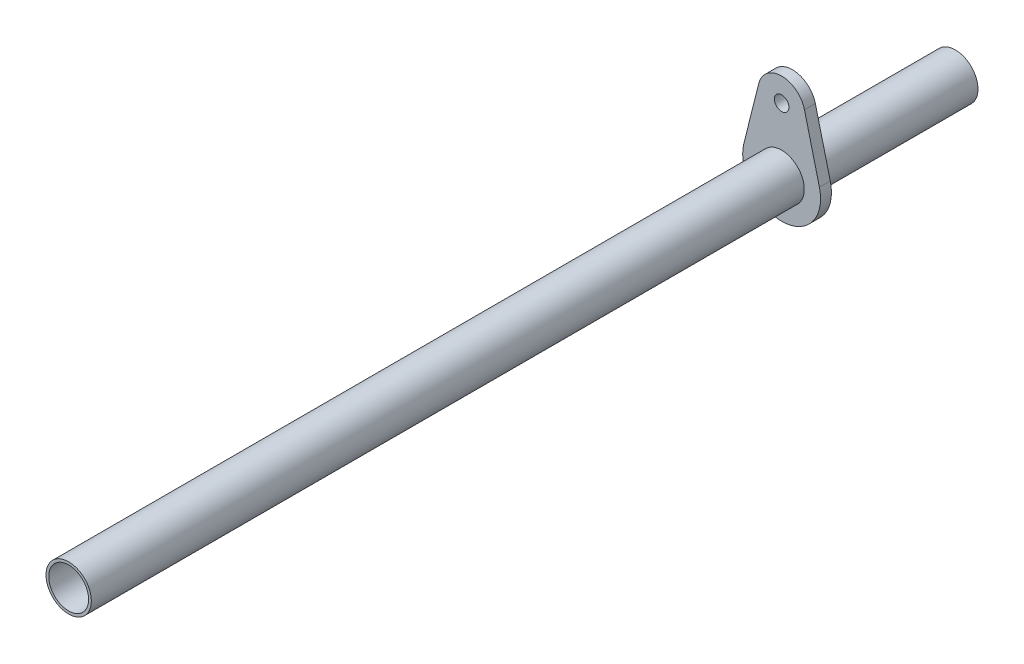
ISO-10303-21;
HEADER;
FILE_DESCRIPTION(('STEP AP214'),'2;1');
FILE_NAME('part.step','',(''),(''),'','','');
FILE_SCHEMA(('AUTOMOTIVE_DESIGN { 1 0 10303 214 1 1 1 1 }'));
ENDSEC;
DATA;
#1=APPLICATION_CONTEXT('core data for automotive mechanical design processes');
#2=APPLICATION_PROTOCOL_DEFINITION('international standard','automotive_design',2000,#1);
#3=PRODUCT_CONTEXT('',#1,'mechanical');
#4=PRODUCT('Part','Part','',(#3));
#5=PRODUCT_RELATED_PRODUCT_CATEGORY('part','',(#4));
#6=PRODUCT_DEFINITION_FORMATION('','',#4);
#7=PRODUCT_DEFINITION_CONTEXT('part definition',#1,'design');
#8=PRODUCT_DEFINITION('design','',#6,#7);
#9=PRODUCT_DEFINITION_SHAPE('','',#8);
#10=(LENGTH_UNIT() NAMED_UNIT(*) SI_UNIT(.MILLI.,.METRE.));
#11=(NAMED_UNIT(*) PLANE_ANGLE_UNIT() SI_UNIT($,.RADIAN.));
#12=(NAMED_UNIT(*) SI_UNIT($,.STERADIAN.) SOLID_ANGLE_UNIT());
#13=UNCERTAINTY_MEASURE_WITH_UNIT(LENGTH_MEASURE(1.E-05),#10,'distance_accuracy_value','');
#14=(GEOMETRIC_REPRESENTATION_CONTEXT(3) GLOBAL_UNCERTAINTY_ASSIGNED_CONTEXT((#13)) GLOBAL_UNIT_ASSIGNED_CONTEXT((#10,
#11,#12)) REPRESENTATION_CONTEXT('',''));
#15=CARTESIAN_POINT('',(0.,0.,0.));
#16=DIRECTION('',(0.,0.,1.));
#17=DIRECTION('',(1.,0.,0.));
#18=AXIS2_PLACEMENT_3D('',#15,#16,#17);
#19=CARTESIAN_POINT('',(0.,0.,490.));
#20=DIRECTION('',(0.,0.,-1.));
#21=DIRECTION('',(-1.,0.,0.));
#22=AXIS2_PLACEMENT_3D('',#19,#20,#21);
#23=CYLINDRICAL_SURFACE('',#22,12.525);
#24=CARTESIAN_POINT('',(0.,0.,490.));
#25=DIRECTION('',(0.,0.,1.));
#26=DIRECTION('',(1.,0.,0.));
#27=AXIS2_PLACEMENT_3D('',#24,#25,#26);
#28=CIRCLE('',#27,12.525);
#29=CARTESIAN_POINT('',(12.525,0.,490.));
#30=VERTEX_POINT('',#29);
#31=EDGE_CURVE('E62',#30,#30,#28,.T.);
#32=ORIENTED_EDGE('',*,*,#31,.F.);
#33=EDGE_LOOP('',(#32));
#34=FACE_BOUND('',#33,.T.);
#35=CARTESIAN_POINT('',(0.,0.,96.));
#36=DIRECTION('',(0.,0.,-1.));
#37=DIRECTION('',(-1.,0.,0.));
#38=AXIS2_PLACEMENT_3D('',#35,#36,#37);
#39=CIRCLE('',#38,12.525);
#40=CARTESIAN_POINT('',(-12.525,0.,96.));
#41=VERTEX_POINT('',#40);
#42=EDGE_CURVE('E12',#41,#41,#39,.T.);
#43=ORIENTED_EDGE('',*,*,#42,.F.);
#44=EDGE_LOOP('',(#43));
#45=FACE_BOUND('',#44,.T.);
#46=ADVANCED_FACE('F53',(#34,#45),#23,.T.);
#47=CARTESIAN_POINT('',(0.,0.,490.));
#48=DIRECTION('',(0.,0.,1.));
#49=DIRECTION('',(1.,0.,0.));
#50=AXIS2_PLACEMENT_3D('',#47,#48,#49);
#51=PLANE('',#50);
#52=ORIENTED_EDGE('',*,*,#31,.T.);
#53=EDGE_LOOP('',(#52));
#54=FACE_BOUND('',#53,.T.);
#55=CARTESIAN_POINT('',(0.,0.,490.));
#56=DIRECTION('',(0.,0.,1.));
#57=DIRECTION('',(1.,0.,0.));
#58=AXIS2_PLACEMENT_3D('',#55,#56,#57);
#59=CIRCLE('',#58,11.025);
#60=CARTESIAN_POINT('',(11.025,0.,490.));
#61=VERTEX_POINT('',#60);
#62=EDGE_CURVE('E133',#61,#61,#59,.T.);
#63=ORIENTED_EDGE('',*,*,#62,.F.);
#64=EDGE_LOOP('',(#63));
#65=FACE_BOUND('',#64,.T.);
#66=ADVANCED_FACE('F147',(#54,#65),#51,.T.);
#67=CARTESIAN_POINT('',(0.,0.,0.));
#68=DIRECTION('',(0.,0.,1.));
#69=DIRECTION('',(1.,0.,0.));
#70=AXIS2_PLACEMENT_3D('',#67,#68,#69);
#71=PLANE('',#70);
#72=CARTESIAN_POINT('',(0.,0.,0.));
#73=DIRECTION('',(0.,0.,1.));
#74=DIRECTION('',(1.,0.,0.));
#75=AXIS2_PLACEMENT_3D('',#72,#73,#74);
#76=CIRCLE('',#75,12.525);
#77=CARTESIAN_POINT('',(12.525,0.,0.));
#78=VERTEX_POINT('',#77);
#79=EDGE_CURVE('E136',#78,#78,#76,.T.);
#80=ORIENTED_EDGE('',*,*,#79,.F.);
#81=EDGE_LOOP('',(#80));
#82=FACE_BOUND('',#81,.T.);
#83=CARTESIAN_POINT('',(0.,0.,0.));
#84=DIRECTION('',(0.,0.,1.));
#85=DIRECTION('',(1.,0.,0.));
#86=AXIS2_PLACEMENT_3D('',#83,#84,#85);
#87=CIRCLE('',#86,11.025);
#88=CARTESIAN_POINT('',(11.025,0.,0.));
#89=VERTEX_POINT('',#88);
#90=EDGE_CURVE('E132',#89,#89,#87,.T.);
#91=ORIENTED_EDGE('',*,*,#90,.T.);
#92=EDGE_LOOP('',(#91));
#93=FACE_BOUND('',#92,.T.);
#94=ADVANCED_FACE('F144',(#82,#93),#71,.F.);
#95=CARTESIAN_POINT('',(0.,0.,90.));
#96=DIRECTION('',(0.,0.,1.));
#97=DIRECTION('',(1.,0.,0.));
#98=AXIS2_PLACEMENT_3D('',#95,#96,#97);
#99=CIRCLE('',#98,12.525);
#100=CARTESIAN_POINT('',(12.525,0.,90.));
#101=VERTEX_POINT('',#100);
#102=EDGE_CURVE('E125',#101,#101,#99,.T.);
#103=ORIENTED_EDGE('',*,*,#102,.F.);
#104=EDGE_LOOP('',(#103));
#105=FACE_BOUND('',#104,.T.);
#106=ORIENTED_EDGE('',*,*,#79,.T.);
#107=EDGE_LOOP('',(#106));
#108=FACE_BOUND('',#107,.T.);
#109=ADVANCED_FACE('F55',(#105,#108),#23,.T.);
#110=CARTESIAN_POINT('',(0.,0.,490.));
#111=DIRECTION('',(0.,0.,-1.));
#112=DIRECTION('',(-1.,0.,0.));
#113=AXIS2_PLACEMENT_3D('',#110,#111,#112);
#114=CYLINDRICAL_SURFACE('',#113,11.025);
#115=ORIENTED_EDGE('',*,*,#62,.T.);
#116=EDGE_LOOP('',(#115));
#117=FACE_BOUND('',#116,.T.);
#118=ORIENTED_EDGE('',*,*,#90,.F.);
#119=EDGE_LOOP('',(#118));
#120=FACE_BOUND('',#119,.T.);
#121=ADVANCED_FACE('F150',(#117,#120),#114,.F.);
#122=CARTESIAN_POINT('',(0.,0.,96.));
#123=DIRECTION('',(0.,0.,-1.));
#124=DIRECTION('',(-1.,0.,0.));
#125=AXIS2_PLACEMENT_3D('',#122,#123,#124);
#126=PLANE('',#125);
#127=CARTESIAN_POINT('',(0.,0.,96.));
#128=DIRECTION('',(0.,0.,1.));
#129=DIRECTION('',(-1.,0.,0.));
#130=AXIS2_PLACEMENT_3D('',#127,#128,#129);
#131=CIRCLE('',#130,21.525);
#132=CARTESIAN_POINT('',(-20.8805859292789,5.22750000000001,96.));
#133=VERTEX_POINT('',#132);
#134=CARTESIAN_POINT('',(20.8805859292789,5.22749999999999,96.));
#135=VERTEX_POINT('',#134);
#136=EDGE_CURVE('E107',#133,#135,#131,.T.);
#137=ORIENTED_EDGE('',*,*,#136,.T.);
#138=DIRECTION('',(-0.242857142857143,0.970062064077998,0.));
#139=VECTOR('',#138,1.);
#140=CARTESIAN_POINT('',(12.6350583846159,38.1632142857143,96.));
#141=LINE('',#140,#139);
#142=CARTESIAN_POINT('',(12.6350583846159,38.1632142857143,96.));
#143=VERTEX_POINT('',#142);
#144=EDGE_CURVE('E101',#135,#143,#141,.T.);
#145=ORIENTED_EDGE('',*,*,#144,.T.);
#146=CARTESIAN_POINT('',(0.,35.,96.));
#147=DIRECTION('',(0.,0.,1.));
#148=DIRECTION('',(-1.,0.,0.));
#149=AXIS2_PLACEMENT_3D('',#146,#147,#148);
#150=CIRCLE('',#149,13.025);
#151=CARTESIAN_POINT('',(-12.6350583846159,38.1632142857143,96.));
#152=VERTEX_POINT('',#151);
#153=EDGE_CURVE('E105',#143,#152,#150,.T.);
#154=ORIENTED_EDGE('',*,*,#153,.T.);
#155=DIRECTION('',(-0.242857142857143,-0.970062064077998,0.));
#156=VECTOR('',#155,1.);
#157=CARTESIAN_POINT('',(-20.8805859292789,5.22750000000001,96.));
#158=LINE('',#157,#156);
#159=EDGE_CURVE('E70',#152,#133,#158,.T.);
#160=ORIENTED_EDGE('',*,*,#159,.T.);
#161=EDGE_LOOP('',(#137,#145,#154,#160));
#162=FACE_BOUND('',#161,.T.);
#163=ORIENTED_EDGE('',*,*,#42,.T.);
#164=EDGE_LOOP('',(#163));
#165=FACE_BOUND('',#164,.T.);
#166=CARTESIAN_POINT('',(0.,35.,96.));
#167=DIRECTION('',(0.,0.,1.));
#168=DIRECTION('',(1.,0.,0.));
#169=AXIS2_PLACEMENT_3D('',#166,#167,#168);
#170=CIRCLE('',#169,4.025);
#171=CARTESIAN_POINT('',(4.02500000000001,35.,96.));
#172=VERTEX_POINT('',#171);
#173=EDGE_CURVE('E176',#172,#172,#170,.T.);
#174=ORIENTED_EDGE('',*,*,#173,.F.);
#175=EDGE_LOOP('',(#174));
#176=FACE_BOUND('',#175,.T.);
#177=ADVANCED_FACE('F102',(#162,#165,#176),#126,.F.);
#178=CARTESIAN_POINT('',(0.,0.,90.));
#179=DIRECTION('',(0.,0.,-1.));
#180=DIRECTION('',(-1.,0.,0.));
#181=AXIS2_PLACEMENT_3D('',#178,#179,#180);
#182=PLANE('',#181);
#183=ORIENTED_EDGE('',*,*,#102,.T.);
#184=EDGE_LOOP('',(#183));
#185=FACE_BOUND('',#184,.T.);
#186=CARTESIAN_POINT('',(0.,0.,90.));
#187=DIRECTION('',(0.,0.,1.));
#188=DIRECTION('',(-1.,0.,0.));
#189=AXIS2_PLACEMENT_3D('',#186,#187,#188);
#190=CIRCLE('',#189,21.525);
#191=CARTESIAN_POINT('',(-20.8805859292789,5.22750000000001,90.));
#192=VERTEX_POINT('',#191);
#193=CARTESIAN_POINT('',(20.8805859292789,5.22749999999999,90.));
#194=VERTEX_POINT('',#193);
#195=EDGE_CURVE('E122',#192,#194,#190,.T.);
#196=ORIENTED_EDGE('',*,*,#195,.F.);
#197=DIRECTION('',(-0.242857142857143,-0.970062064077998,0.));
#198=VECTOR('',#197,1.);
#199=CARTESIAN_POINT('',(-20.8805859292789,5.22750000000001,90.));
#200=LINE('',#199,#198);
#201=CARTESIAN_POINT('',(-12.6350583846159,38.1632142857143,90.));
#202=VERTEX_POINT('',#201);
#203=EDGE_CURVE('E93',#202,#192,#200,.T.);
#204=ORIENTED_EDGE('',*,*,#203,.F.);
#205=CARTESIAN_POINT('',(0.,35.,90.));
#206=DIRECTION('',(0.,0.,1.));
#207=DIRECTION('',(-1.,0.,0.));
#208=AXIS2_PLACEMENT_3D('',#205,#206,#207);
#209=CIRCLE('',#208,13.025);
#210=CARTESIAN_POINT('',(12.6350583846159,38.1632142857143,90.));
#211=VERTEX_POINT('',#210);
#212=EDGE_CURVE('E87',#211,#202,#209,.T.);
#213=ORIENTED_EDGE('',*,*,#212,.F.);
#214=DIRECTION('',(-0.242857142857143,0.970062064077998,0.));
#215=VECTOR('',#214,1.);
#216=CARTESIAN_POINT('',(12.6350583846159,38.1632142857143,90.));
#217=LINE('',#216,#215);
#218=EDGE_CURVE('E112',#194,#211,#217,.T.);
#219=ORIENTED_EDGE('',*,*,#218,.F.);
#220=EDGE_LOOP('',(#196,#204,#213,#219));
#221=FACE_BOUND('',#220,.T.);
#222=CARTESIAN_POINT('',(0.,35.,90.));
#223=DIRECTION('',(0.,0.,1.));
#224=DIRECTION('',(1.,0.,0.));
#225=AXIS2_PLACEMENT_3D('',#222,#223,#224);
#226=CIRCLE('',#225,4.025);
#227=CARTESIAN_POINT('',(4.02500000000001,35.,90.));
#228=VERTEX_POINT('',#227);
#229=EDGE_CURVE('E178',#228,#228,#226,.T.);
#230=ORIENTED_EDGE('',*,*,#229,.T.);
#231=EDGE_LOOP('',(#230));
#232=FACE_BOUND('',#231,.T.);
#233=ADVANCED_FACE('F158',(#185,#221,#232),#182,.T.);
#234=CARTESIAN_POINT('',(0.,0.,96.));
#235=DIRECTION('',(0.,0.,-1.));
#236=DIRECTION('',(-1.,0.,0.));
#237=AXIS2_PLACEMENT_3D('',#234,#235,#236);
#238=CYLINDRICAL_SURFACE('',#237,21.525);
#239=ORIENTED_EDGE('',*,*,#195,.T.);
#240=DIRECTION('',(0.,0.,-1.));
#241=VECTOR('',#240,1.);
#242=CARTESIAN_POINT('',(20.8805859292789,5.22749999999999,96.));
#243=LINE('',#242,#241);
#244=EDGE_CURVE('E113',#135,#194,#243,.T.);
#245=ORIENTED_EDGE('',*,*,#244,.F.);
#246=ORIENTED_EDGE('',*,*,#136,.F.);
#247=DIRECTION('',(0.,0.,-1.));
#248=VECTOR('',#247,1.);
#249=CARTESIAN_POINT('',(-20.8805859292789,5.22750000000001,96.));
#250=LINE('',#249,#248);
#251=EDGE_CURVE('E118',#133,#192,#250,.T.);
#252=ORIENTED_EDGE('',*,*,#251,.T.);
#253=EDGE_LOOP('',(#239,#245,#246,#252));
#254=FACE_BOUND('',#253,.T.);
#255=ADVANCED_FACE('F197',(#254),#238,.T.);
#256=CARTESIAN_POINT('',(12.6350583846159,38.1632142857143,96.));
#257=DIRECTION('',(-0.970062064077998,-0.242857142857143,0.));
#258=DIRECTION('',(0.242857142857143,-0.970062064077998,0.));
#259=AXIS2_PLACEMENT_3D('',#256,#257,#258);
#260=PLANE('',#259);
#261=ORIENTED_EDGE('',*,*,#218,.T.);
#262=DIRECTION('',(0.,0.,-1.));
#263=VECTOR('',#262,1.);
#264=CARTESIAN_POINT('',(12.6350583846159,38.1632142857143,96.));
#265=LINE('',#264,#263);
#266=EDGE_CURVE('E110',#143,#211,#265,.T.);
#267=ORIENTED_EDGE('',*,*,#266,.F.);
#268=ORIENTED_EDGE('',*,*,#144,.F.);
#269=ORIENTED_EDGE('',*,*,#244,.T.);
#270=EDGE_LOOP('',(#261,#267,#268,#269));
#271=FACE_BOUND('',#270,.T.);
#272=ADVANCED_FACE('F111',(#271),#260,.F.);
#273=CARTESIAN_POINT('',(0.,35.,96.));
#274=DIRECTION('',(0.,0.,-1.));
#275=DIRECTION('',(-1.,0.,0.));
#276=AXIS2_PLACEMENT_3D('',#273,#274,#275);
#277=CYLINDRICAL_SURFACE('',#276,13.025);
#278=ORIENTED_EDGE('',*,*,#212,.T.);
#279=DIRECTION('',(0.,0.,-1.));
#280=VECTOR('',#279,1.);
#281=CARTESIAN_POINT('',(-12.6350583846159,38.1632142857143,96.));
#282=LINE('',#281,#280);
#283=EDGE_CURVE('E114',#152,#202,#282,.T.);
#284=ORIENTED_EDGE('',*,*,#283,.F.);
#285=ORIENTED_EDGE('',*,*,#153,.F.);
#286=ORIENTED_EDGE('',*,*,#266,.T.);
#287=EDGE_LOOP('',(#278,#284,#285,#286));
#288=FACE_BOUND('',#287,.T.);
#289=ADVANCED_FACE('F116',(#288),#277,.T.);
#290=CARTESIAN_POINT('',(-20.8805859292789,5.22750000000001,96.));
#291=DIRECTION('',(0.970062064077998,-0.242857142857143,0.));
#292=DIRECTION('',(0.242857142857143,0.970062064077998,0.));
#293=AXIS2_PLACEMENT_3D('',#290,#291,#292);
#294=PLANE('',#293);
#295=ORIENTED_EDGE('',*,*,#203,.T.);
#296=ORIENTED_EDGE('',*,*,#251,.F.);
#297=ORIENTED_EDGE('',*,*,#159,.F.);
#298=ORIENTED_EDGE('',*,*,#283,.T.);
#299=EDGE_LOOP('',(#295,#296,#297,#298));
#300=FACE_BOUND('',#299,.T.);
#301=ADVANCED_FACE('F189',(#300),#294,.F.);
#302=CARTESIAN_POINT('',(0.,35.,96.));
#303=DIRECTION('',(0.,0.,-1.));
#304=DIRECTION('',(-1.,0.,0.));
#305=AXIS2_PLACEMENT_3D('',#302,#303,#304);
#306=CYLINDRICAL_SURFACE('',#305,4.025);
#307=ORIENTED_EDGE('',*,*,#173,.T.);
#308=EDGE_LOOP('',(#307));
#309=FACE_BOUND('',#308,.T.);
#310=ORIENTED_EDGE('',*,*,#229,.F.);
#311=EDGE_LOOP('',(#310));
#312=FACE_BOUND('',#311,.T.);
#313=ADVANCED_FACE('F187',(#309,#312),#306,.F.);
#314=CLOSED_SHELL('',(#46,#66,#94,#109,#121,#177,#233,#255,#272,#289,#301,#313));
#315=MANIFOLD_SOLID_BREP('B2',#314);
#316=ADVANCED_BREP_SHAPE_REPRESENTATION('',(#18,#315),#14);
#317=SHAPE_DEFINITION_REPRESENTATION(#9,#316);
ENDSEC;
END-ISO-10303-21;
